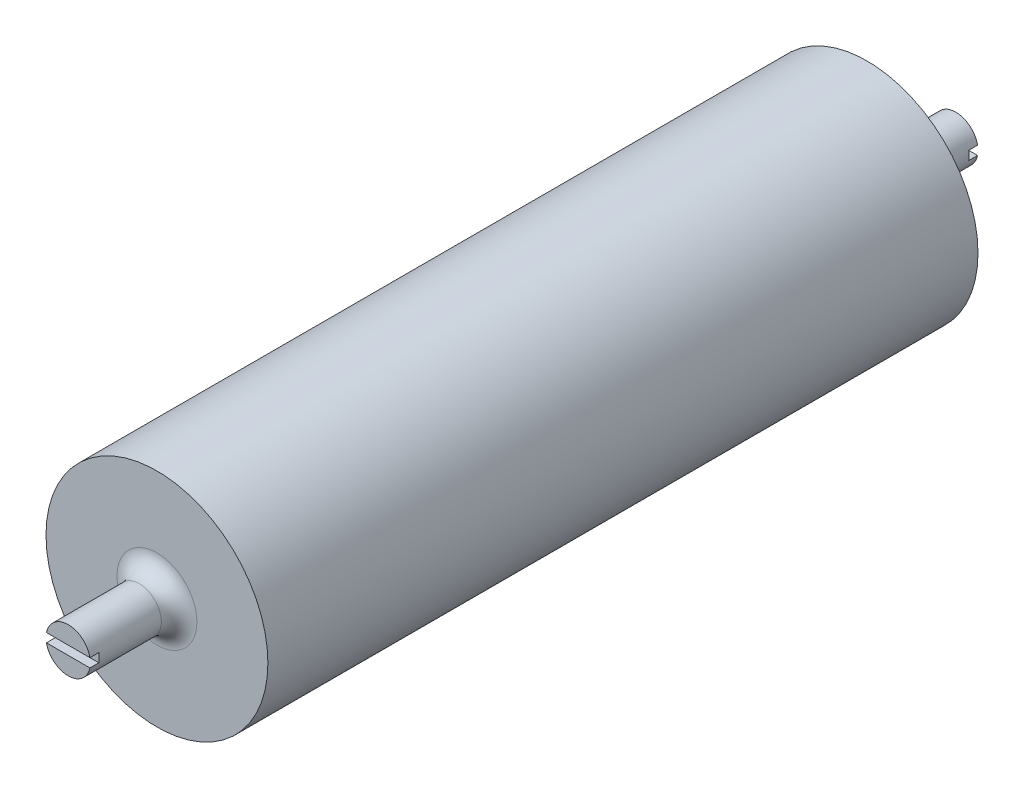
ISO-10303-21;
HEADER;
FILE_DESCRIPTION(('STEP AP214'),'2;1');
FILE_NAME('part.step','',(''),(''),'','','');
FILE_SCHEMA(('AUTOMOTIVE_DESIGN { 1 0 10303 214 1 1 1 1 }'));
ENDSEC;
DATA;
#1=APPLICATION_CONTEXT('core data for automotive mechanical design processes');
#2=APPLICATION_PROTOCOL_DEFINITION('international standard','automotive_design',2000,#1);
#3=PRODUCT_CONTEXT('',#1,'mechanical');
#4=PRODUCT('Part','Part','',(#3));
#5=PRODUCT_RELATED_PRODUCT_CATEGORY('part','',(#4));
#6=PRODUCT_DEFINITION_FORMATION('','',#4);
#7=PRODUCT_DEFINITION_CONTEXT('part definition',#1,'design');
#8=PRODUCT_DEFINITION('design','',#6,#7);
#9=PRODUCT_DEFINITION_SHAPE('','',#8);
#10=(LENGTH_UNIT() NAMED_UNIT(*) SI_UNIT(.MILLI.,.METRE.));
#11=(NAMED_UNIT(*) PLANE_ANGLE_UNIT() SI_UNIT($,.RADIAN.));
#12=(NAMED_UNIT(*) SI_UNIT($,.STERADIAN.) SOLID_ANGLE_UNIT());
#13=UNCERTAINTY_MEASURE_WITH_UNIT(LENGTH_MEASURE(1.E-05),#10,'distance_accuracy_value','');
#14=(GEOMETRIC_REPRESENTATION_CONTEXT(3) GLOBAL_UNCERTAINTY_ASSIGNED_CONTEXT((#13)) GLOBAL_UNIT_ASSIGNED_CONTEXT((#10,
#11,#12)) REPRESENTATION_CONTEXT('',''));
#15=CARTESIAN_POINT('',(0.,0.,0.));
#16=DIRECTION('',(0.,0.,1.));
#17=DIRECTION('',(1.,0.,0.));
#18=AXIS2_PLACEMENT_3D('',#15,#16,#17);
#19=CARTESIAN_POINT('',(0.,0.,90.));
#20=DIRECTION('',(0.,0.,1.));
#21=DIRECTION('',(1.,0.,0.));
#22=AXIS2_PLACEMENT_3D('',#19,#20,#21);
#23=PLANE('',#22);
#24=DIRECTION('',(-1.,0.,0.));
#25=VECTOR('',#24,1.);
#26=CARTESIAN_POINT('',(-2.44948974278318,0.5,90.));
#27=LINE('',#26,#25);
#28=CARTESIAN_POINT('',(2.44948974278318,0.5,90.));
#29=VERTEX_POINT('',#28);
#30=CARTESIAN_POINT('',(-2.44948974278318,0.5,90.));
#31=VERTEX_POINT('',#30);
#32=EDGE_CURVE('E127',#29,#31,#27,.T.);
#33=ORIENTED_EDGE('',*,*,#32,.F.);
#34=CARTESIAN_POINT('',(0.,0.,90.));
#35=DIRECTION('',(0.,0.,1.));
#36=DIRECTION('',(1.,0.,0.));
#37=AXIS2_PLACEMENT_3D('',#34,#35,#36);
#38=CIRCLE('',#37,2.5);
#39=EDGE_CURVE('E189',#29,#31,#38,.T.);
#40=ORIENTED_EDGE('',*,*,#39,.T.);
#41=EDGE_LOOP('',(#33,#40));
#42=FACE_BOUND('',#41,.T.);
#43=ADVANCED_FACE('F44',(#42),#23,.T.);
#44=CARTESIAN_POINT('',(0.,0.,-10.));
#45=DIRECTION('',(0.,0.,1.));
#46=DIRECTION('',(1.,0.,0.));
#47=AXIS2_PLACEMENT_3D('',#44,#45,#46);
#48=PLANE('',#47);
#49=CARTESIAN_POINT('',(0.,0.,-10.));
#50=DIRECTION('',(0.,0.,1.));
#51=DIRECTION('',(1.,0.,0.));
#52=AXIS2_PLACEMENT_3D('',#49,#50,#51);
#53=CIRCLE('',#52,2.5);
#54=CARTESIAN_POINT('',(2.44948974278318,0.5,-10.));
#55=VERTEX_POINT('',#54);
#56=CARTESIAN_POINT('',(-2.44948974278318,0.5,-10.));
#57=VERTEX_POINT('',#56);
#58=EDGE_CURVE('E185',#55,#57,#53,.T.);
#59=ORIENTED_EDGE('',*,*,#58,.F.);
#60=DIRECTION('',(1.,0.,0.));
#61=VECTOR('',#60,1.);
#62=CARTESIAN_POINT('',(2.44948974278318,0.5,-10.));
#63=LINE('',#62,#61);
#64=EDGE_CURVE('E146',#57,#55,#63,.T.);
#65=ORIENTED_EDGE('',*,*,#64,.F.);
#66=EDGE_LOOP('',(#59,#65));
#67=FACE_BOUND('',#66,.T.);
#68=ADVANCED_FACE('F218',(#67),#48,.F.);
#69=CARTESIAN_POINT('',(0.,0.,-2.));
#70=DIRECTION('',(0.,0.,1.));
#71=DIRECTION('',(1.,0.,0.));
#72=AXIS2_PLACEMENT_3D('',#69,#70,#71);
#73=TOROIDAL_SURFACE('',#72,4.5,2.);
#74=CARTESIAN_POINT('',(0.,0.,0.));
#75=DIRECTION('',(0.,0.,1.));
#76=DIRECTION('',(1.,0.,0.));
#77=AXIS2_PLACEMENT_3D('',#74,#75,#76);
#78=CIRCLE('',#77,4.5);
#79=CARTESIAN_POINT('',(4.5,0.,0.));
#80=VERTEX_POINT('',#79);
#81=EDGE_CURVE('E53',#80,#80,#78,.T.);
#82=ORIENTED_EDGE('',*,*,#81,.F.);
#83=EDGE_LOOP('',(#82));
#84=FACE_BOUND('',#83,.T.);
#85=CARTESIAN_POINT('',(0.,0.,-1.99999999999999));
#86=DIRECTION('',(0.,0.,1.));
#87=DIRECTION('',(1.,0.,0.));
#88=AXIS2_PLACEMENT_3D('',#85,#86,#87);
#89=CIRCLE('',#88,2.5);
#90=CARTESIAN_POINT('',(2.5,0.,-1.99999999999999));
#91=VERTEX_POINT('',#90);
#92=EDGE_CURVE('E11',#91,#91,#89,.F.);
#93=ORIENTED_EDGE('',*,*,#92,.F.);
#94=EDGE_LOOP('',(#93));
#95=FACE_BOUND('',#94,.T.);
#96=ADVANCED_FACE('F46',(#84,#95),#73,.F.);
#97=CARTESIAN_POINT('',(0.,0.,82.));
#98=DIRECTION('',(0.,0.,1.));
#99=DIRECTION('',(1.,0.,0.));
#100=AXIS2_PLACEMENT_3D('',#97,#98,#99);
#101=TOROIDAL_SURFACE('',#100,4.5,2.);
#102=CARTESIAN_POINT('',(0.,0.,80.));
#103=DIRECTION('',(0.,0.,1.));
#104=DIRECTION('',(1.,0.,0.));
#105=AXIS2_PLACEMENT_3D('',#102,#103,#104);
#106=CIRCLE('',#105,4.5);
#107=CARTESIAN_POINT('',(4.5,0.,80.));
#108=VERTEX_POINT('',#107);
#109=EDGE_CURVE('E198',#108,#108,#106,.F.);
#110=ORIENTED_EDGE('',*,*,#109,.F.);
#111=EDGE_LOOP('',(#110));
#112=FACE_BOUND('',#111,.T.);
#113=CARTESIAN_POINT('',(0.,0.,82.));
#114=DIRECTION('',(0.,0.,1.));
#115=DIRECTION('',(1.,0.,0.));
#116=AXIS2_PLACEMENT_3D('',#113,#114,#115);
#117=CIRCLE('',#116,2.5);
#118=CARTESIAN_POINT('',(2.5,0.,82.));
#119=VERTEX_POINT('',#118);
#120=EDGE_CURVE('E205',#119,#119,#117,.T.);
#121=ORIENTED_EDGE('',*,*,#120,.F.);
#122=EDGE_LOOP('',(#121));
#123=FACE_BOUND('',#122,.T.);
#124=ADVANCED_FACE('F217',(#112,#123),#101,.F.);
#125=CARTESIAN_POINT('',(0.,0.,80.));
#126=DIRECTION('',(0.,0.,-1.));
#127=DIRECTION('',(-1.,0.,0.));
#128=AXIS2_PLACEMENT_3D('',#125,#126,#127);
#129=CYLINDRICAL_SURFACE('',#128,12.5);
#130=CARTESIAN_POINT('',(0.,0.,80.));
#131=DIRECTION('',(0.,0.,1.));
#132=DIRECTION('',(1.,0.,0.));
#133=AXIS2_PLACEMENT_3D('',#130,#131,#132);
#134=CIRCLE('',#133,12.5);
#135=CARTESIAN_POINT('',(12.5,0.,80.));
#136=VERTEX_POINT('',#135);
#137=EDGE_CURVE('E194',#136,#136,#134,.T.);
#138=ORIENTED_EDGE('',*,*,#137,.F.);
#139=EDGE_LOOP('',(#138));
#140=FACE_BOUND('',#139,.T.);
#141=CARTESIAN_POINT('',(0.,0.,0.));
#142=DIRECTION('',(0.,0.,1.));
#143=DIRECTION('',(1.,0.,0.));
#144=AXIS2_PLACEMENT_3D('',#141,#142,#143);
#145=CIRCLE('',#144,12.5);
#146=CARTESIAN_POINT('',(12.5,0.,0.));
#147=VERTEX_POINT('',#146);
#148=EDGE_CURVE('E193',#147,#147,#145,.T.);
#149=ORIENTED_EDGE('',*,*,#148,.T.);
#150=EDGE_LOOP('',(#149));
#151=FACE_BOUND('',#150,.T.);
#152=ADVANCED_FACE('F384',(#140,#151),#129,.T.);
#153=CARTESIAN_POINT('',(0.,0.,80.));
#154=DIRECTION('',(0.,0.,1.));
#155=DIRECTION('',(1.,0.,0.));
#156=AXIS2_PLACEMENT_3D('',#153,#154,#155);
#157=PLANE('',#156);
#158=ORIENTED_EDGE('',*,*,#109,.T.);
#159=EDGE_LOOP('',(#158));
#160=FACE_BOUND('',#159,.T.);
#161=ORIENTED_EDGE('',*,*,#137,.T.);
#162=EDGE_LOOP('',(#161));
#163=FACE_BOUND('',#162,.T.);
#164=ADVANCED_FACE('F398',(#160,#163),#157,.T.);
#165=CARTESIAN_POINT('',(0.,0.,0.));
#166=DIRECTION('',(0.,0.,1.));
#167=DIRECTION('',(1.,0.,0.));
#168=AXIS2_PLACEMENT_3D('',#165,#166,#167);
#169=PLANE('',#168);
#170=ORIENTED_EDGE('',*,*,#81,.T.);
#171=EDGE_LOOP('',(#170));
#172=FACE_BOUND('',#171,.T.);
#173=ORIENTED_EDGE('',*,*,#148,.F.);
#174=EDGE_LOOP('',(#173));
#175=FACE_BOUND('',#174,.T.);
#176=ADVANCED_FACE('F212',(#172,#175),#169,.F.);
#177=CARTESIAN_POINT('',(-2.44948974278318,-0.5,-10.));
#178=VERTEX_POINT('',#177);
#179=CARTESIAN_POINT('',(2.44948974278318,-0.5,-10.));
#180=VERTEX_POINT('',#179);
#181=EDGE_CURVE('E181',#178,#180,#53,.T.);
#182=ORIENTED_EDGE('',*,*,#181,.F.);
#183=DIRECTION('',(-1.,0.,0.));
#184=VECTOR('',#183,1.);
#185=CARTESIAN_POINT('',(2.44948974278318,-0.5,-10.));
#186=LINE('',#185,#184);
#187=EDGE_CURVE('E157',#180,#178,#186,.T.);
#188=ORIENTED_EDGE('',*,*,#187,.F.);
#189=EDGE_LOOP('',(#182,#188));
#190=FACE_BOUND('',#189,.T.);
#191=ADVANCED_FACE('F223',(#190),#48,.F.);
#192=CARTESIAN_POINT('',(0.,0.,90.));
#193=DIRECTION('',(0.,0.,-1.));
#194=DIRECTION('',(-1.,0.,0.));
#195=AXIS2_PLACEMENT_3D('',#192,#193,#194);
#196=CYLINDRICAL_SURFACE('',#195,2.5);
#197=CARTESIAN_POINT('',(0.,0.,-9.));
#198=DIRECTION('',(0.,0.,-1.));
#199=DIRECTION('',(-1.,0.,0.));
#200=AXIS2_PLACEMENT_3D('',#197,#198,#199);
#201=CIRCLE('',#200,2.5);
#202=CARTESIAN_POINT('',(2.44948974278318,0.5,-9.));
#203=VERTEX_POINT('',#202);
#204=CARTESIAN_POINT('',(2.44948974278318,-0.5,-9.));
#205=VERTEX_POINT('',#204);
#206=EDGE_CURVE('E143',#203,#205,#201,.T.);
#207=ORIENTED_EDGE('',*,*,#206,.F.);
#208=DIRECTION('',(0.,0.,-1.));
#209=VECTOR('',#208,1.);
#210=CARTESIAN_POINT('',(2.44948974278318,0.5,-9.));
#211=LINE('',#210,#209);
#212=EDGE_CURVE('E163',#203,#55,#211,.T.);
#213=ORIENTED_EDGE('',*,*,#212,.T.);
#214=ORIENTED_EDGE('',*,*,#58,.T.);
#215=DIRECTION('',(0.,0.,-1.));
#216=VECTOR('',#215,1.);
#217=CARTESIAN_POINT('',(-2.44948974278318,0.5,-9.));
#218=LINE('',#217,#216);
#219=CARTESIAN_POINT('',(-2.44948974278318,0.5,-9.));
#220=VERTEX_POINT('',#219);
#221=EDGE_CURVE('E168',#220,#57,#218,.T.);
#222=ORIENTED_EDGE('',*,*,#221,.F.);
#223=CARTESIAN_POINT('',(0.,0.,-9.));
#224=DIRECTION('',(0.,0.,-1.));
#225=DIRECTION('',(-1.,0.,0.));
#226=AXIS2_PLACEMENT_3D('',#223,#224,#225);
#227=CIRCLE('',#226,2.5);
#228=CARTESIAN_POINT('',(-2.44948974278318,-0.5,-9.00000000000001));
#229=VERTEX_POINT('',#228);
#230=EDGE_CURVE('E149',#229,#220,#227,.T.);
#231=ORIENTED_EDGE('',*,*,#230,.F.);
#232=DIRECTION('',(0.,0.,-1.));
#233=VECTOR('',#232,1.);
#234=CARTESIAN_POINT('',(-2.44948974278318,-0.5,-9.));
#235=LINE('',#234,#233);
#236=EDGE_CURVE('E171',#229,#178,#235,.T.);
#237=ORIENTED_EDGE('',*,*,#236,.T.);
#238=ORIENTED_EDGE('',*,*,#181,.T.);
#239=DIRECTION('',(0.,0.,-1.));
#240=VECTOR('',#239,1.);
#241=CARTESIAN_POINT('',(2.44948974278318,-0.5,-9.));
#242=LINE('',#241,#240);
#243=EDGE_CURVE('E156',#205,#180,#242,.T.);
#244=ORIENTED_EDGE('',*,*,#243,.F.);
#245=EDGE_LOOP('',(#207,#213,#214,#222,#231,#237,#238,#244));
#246=FACE_BOUND('',#245,.T.);
#247=ORIENTED_EDGE('',*,*,#92,.T.);
#248=EDGE_LOOP('',(#247));
#249=FACE_BOUND('',#248,.T.);
#250=ADVANCED_FACE('F221',(#246,#249),#196,.T.);
#251=CARTESIAN_POINT('',(0.,0.,89.));
#252=DIRECTION('',(0.,0.,1.));
#253=DIRECTION('',(1.,0.,0.));
#254=AXIS2_PLACEMENT_3D('',#251,#252,#253);
#255=CIRCLE('',#254,2.5);
#256=CARTESIAN_POINT('',(-2.44948974278318,0.5,89.));
#257=VERTEX_POINT('',#256);
#258=CARTESIAN_POINT('',(-2.44948974278318,-0.5,89.));
#259=VERTEX_POINT('',#258);
#260=EDGE_CURVE('E117',#257,#259,#255,.T.);
#261=ORIENTED_EDGE('',*,*,#260,.F.);
#262=DIRECTION('',(0.,0.,1.));
#263=VECTOR('',#262,1.);
#264=CARTESIAN_POINT('',(-2.44948974278318,0.5,89.));
#265=LINE('',#264,#263);
#266=EDGE_CURVE('E160',#257,#31,#265,.T.);
#267=ORIENTED_EDGE('',*,*,#266,.T.);
#268=ORIENTED_EDGE('',*,*,#39,.F.);
#269=DIRECTION('',(0.,0.,1.));
#270=VECTOR('',#269,1.);
#271=CARTESIAN_POINT('',(2.44948974278318,0.5,89.));
#272=LINE('',#271,#270);
#273=CARTESIAN_POINT('',(2.44948974278318,0.5,89.));
#274=VERTEX_POINT('',#273);
#275=EDGE_CURVE('E138',#274,#29,#272,.T.);
#276=ORIENTED_EDGE('',*,*,#275,.F.);
#277=CARTESIAN_POINT('',(0.,0.,89.));
#278=DIRECTION('',(0.,0.,1.));
#279=DIRECTION('',(1.,0.,0.));
#280=AXIS2_PLACEMENT_3D('',#277,#278,#279);
#281=CIRCLE('',#280,2.5);
#282=CARTESIAN_POINT('',(2.44948974278318,-0.5,89.));
#283=VERTEX_POINT('',#282);
#284=EDGE_CURVE('E116',#283,#274,#281,.T.);
#285=ORIENTED_EDGE('',*,*,#284,.F.);
#286=DIRECTION('',(0.,0.,1.));
#287=VECTOR('',#286,1.);
#288=CARTESIAN_POINT('',(2.44948974278318,-0.5,89.));
#289=LINE('',#288,#287);
#290=CARTESIAN_POINT('',(2.44948974278318,-0.5,90.));
#291=VERTEX_POINT('',#290);
#292=EDGE_CURVE('E112',#283,#291,#289,.T.);
#293=ORIENTED_EDGE('',*,*,#292,.T.);
#294=CARTESIAN_POINT('',(-2.44948974278318,-0.5,90.));
#295=VERTEX_POINT('',#294);
#296=EDGE_CURVE('E133',#295,#291,#38,.T.);
#297=ORIENTED_EDGE('',*,*,#296,.F.);
#298=DIRECTION('',(0.,0.,1.));
#299=VECTOR('',#298,1.);
#300=CARTESIAN_POINT('',(-2.44948974278318,-0.5,89.));
#301=LINE('',#300,#299);
#302=EDGE_CURVE('E60',#259,#295,#301,.T.);
#303=ORIENTED_EDGE('',*,*,#302,.F.);
#304=EDGE_LOOP('',(#261,#267,#268,#276,#285,#293,#297,#303));
#305=FACE_BOUND('',#304,.T.);
#306=ORIENTED_EDGE('',*,*,#120,.T.);
#307=EDGE_LOOP('',(#306));
#308=FACE_BOUND('',#307,.T.);
#309=ADVANCED_FACE('F130',(#305,#308),#196,.T.);
#310=DIRECTION('',(1.,0.,0.));
#311=VECTOR('',#310,1.);
#312=CARTESIAN_POINT('',(-2.44948974278318,-0.5,90.));
#313=LINE('',#312,#311);
#314=EDGE_CURVE('E252',#295,#291,#313,.T.);
#315=ORIENTED_EDGE('',*,*,#314,.F.);
#316=ORIENTED_EDGE('',*,*,#296,.T.);
#317=EDGE_LOOP('',(#315,#316));
#318=FACE_BOUND('',#317,.T.);
#319=ADVANCED_FACE('F230',(#318),#23,.T.);
#320=CARTESIAN_POINT('',(2.44948974278318,0.5,-9.));
#321=DIRECTION('',(0.,1.,0.));
#322=DIRECTION('',(0.,0.,1.));
#323=AXIS2_PLACEMENT_3D('',#320,#321,#322);
#324=PLANE('',#323);
#325=ORIENTED_EDGE('',*,*,#64,.T.);
#326=ORIENTED_EDGE('',*,*,#212,.F.);
#327=DIRECTION('',(1.,0.,0.));
#328=VECTOR('',#327,1.);
#329=CARTESIAN_POINT('',(2.44948974278318,0.5,-9.));
#330=LINE('',#329,#328);
#331=EDGE_CURVE('E152',#220,#203,#330,.T.);
#332=ORIENTED_EDGE('',*,*,#331,.F.);
#333=ORIENTED_EDGE('',*,*,#221,.T.);
#334=EDGE_LOOP('',(#325,#326,#332,#333));
#335=FACE_BOUND('',#334,.T.);
#336=ADVANCED_FACE('F244',(#335),#324,.F.);
#337=CARTESIAN_POINT('',(2.44948974278318,-0.5,-9.));
#338=DIRECTION('',(0.,-1.,0.));
#339=DIRECTION('',(0.,0.,-1.));
#340=AXIS2_PLACEMENT_3D('',#337,#338,#339);
#341=PLANE('',#340);
#342=ORIENTED_EDGE('',*,*,#187,.T.);
#343=ORIENTED_EDGE('',*,*,#236,.F.);
#344=DIRECTION('',(-1.,0.,0.));
#345=VECTOR('',#344,1.);
#346=CARTESIAN_POINT('',(2.44948974278318,-0.5,-9.));
#347=LINE('',#346,#345);
#348=EDGE_CURVE('E68',#205,#229,#347,.T.);
#349=ORIENTED_EDGE('',*,*,#348,.F.);
#350=ORIENTED_EDGE('',*,*,#243,.T.);
#351=EDGE_LOOP('',(#342,#343,#349,#350));
#352=FACE_BOUND('',#351,.T.);
#353=ADVANCED_FACE('F249',(#352),#341,.F.);
#354=CARTESIAN_POINT('',(0.,0.,-9.));
#355=DIRECTION('',(0.,0.,-1.));
#356=DIRECTION('',(-1.,0.,0.));
#357=AXIS2_PLACEMENT_3D('',#354,#355,#356);
#358=PLANE('',#357);
#359=ORIENTED_EDGE('',*,*,#206,.T.);
#360=ORIENTED_EDGE('',*,*,#348,.T.);
#361=ORIENTED_EDGE('',*,*,#230,.T.);
#362=ORIENTED_EDGE('',*,*,#331,.T.);
#363=EDGE_LOOP('',(#359,#360,#361,#362));
#364=FACE_BOUND('',#363,.T.);
#365=ADVANCED_FACE('F267',(#364),#358,.T.);
#366=CARTESIAN_POINT('',(-2.44948974278318,0.5,89.));
#367=DIRECTION('',(0.,1.,0.));
#368=DIRECTION('',(0.,0.,1.));
#369=AXIS2_PLACEMENT_3D('',#366,#367,#368);
#370=PLANE('',#369);
#371=ORIENTED_EDGE('',*,*,#32,.T.);
#372=ORIENTED_EDGE('',*,*,#266,.F.);
#373=DIRECTION('',(-1.,0.,0.));
#374=VECTOR('',#373,1.);
#375=CARTESIAN_POINT('',(-2.44948974278318,0.5,89.));
#376=LINE('',#375,#374);
#377=EDGE_CURVE('E123',#274,#257,#376,.T.);
#378=ORIENTED_EDGE('',*,*,#377,.F.);
#379=ORIENTED_EDGE('',*,*,#275,.T.);
#380=EDGE_LOOP('',(#371,#372,#378,#379));
#381=FACE_BOUND('',#380,.T.);
#382=ADVANCED_FACE('F263',(#381),#370,.F.);
#383=CARTESIAN_POINT('',(-2.44948974278318,-0.5,89.));
#384=DIRECTION('',(0.,-1.,0.));
#385=DIRECTION('',(0.,0.,-1.));
#386=AXIS2_PLACEMENT_3D('',#383,#384,#385);
#387=PLANE('',#386);
#388=ORIENTED_EDGE('',*,*,#314,.T.);
#389=ORIENTED_EDGE('',*,*,#292,.F.);
#390=DIRECTION('',(1.,0.,0.));
#391=VECTOR('',#390,1.);
#392=CARTESIAN_POINT('',(-2.44948974278318,-0.5,89.));
#393=LINE('',#392,#391);
#394=EDGE_CURVE('E108',#259,#283,#393,.T.);
#395=ORIENTED_EDGE('',*,*,#394,.F.);
#396=ORIENTED_EDGE('',*,*,#302,.T.);
#397=EDGE_LOOP('',(#388,#389,#395,#396));
#398=FACE_BOUND('',#397,.T.);
#399=ADVANCED_FACE('F110',(#398),#387,.F.);
#400=CARTESIAN_POINT('',(0.,0.,89.));
#401=DIRECTION('',(0.,0.,1.));
#402=DIRECTION('',(1.,0.,0.));
#403=AXIS2_PLACEMENT_3D('',#400,#401,#402);
#404=PLANE('',#403);
#405=ORIENTED_EDGE('',*,*,#260,.T.);
#406=ORIENTED_EDGE('',*,*,#394,.T.);
#407=ORIENTED_EDGE('',*,*,#284,.T.);
#408=ORIENTED_EDGE('',*,*,#377,.T.);
#409=EDGE_LOOP('',(#405,#406,#407,#408));
#410=FACE_BOUND('',#409,.T.);
#411=ADVANCED_FACE('F121',(#410),#404,.T.);
#412=CLOSED_SHELL('',(#43,#68,#96,#124,#152,#164,#176,#191,#250,#309,#319,#336,#353,#365,#382,
#399,#411));
#413=CARTESIAN_POINT('',(0.,0.,-5.));
#414=DIRECTION('',(0.,0.,1.));
#415=DIRECTION('',(1.,0.,0.));
#416=AXIS2_PLACEMENT_3D('',#413,#414,#415);
#417=CYLINDRICAL_SURFACE('',#416,0.5);
#418=CARTESIAN_POINT('',(0.,0.,-5.));
#419=DIRECTION('',(0.,0.,1.));
#420=DIRECTION('',(1.,0.,0.));
#421=AXIS2_PLACEMENT_3D('',#418,#419,#420);
#422=CIRCLE('',#421,0.5);
#423=CARTESIAN_POINT('',(0.5,0.,-5.));
#424=VERTEX_POINT('',#423);
#425=EDGE_CURVE('E177',#424,#424,#422,.T.);
#426=ORIENTED_EDGE('',*,*,#425,.F.);
#427=EDGE_LOOP('',(#426));
#428=FACE_BOUND('',#427,.T.);
#429=CARTESIAN_POINT('',(0.,0.,85.));
#430=DIRECTION('',(0.,0.,1.));
#431=DIRECTION('',(1.,0.,0.));
#432=AXIS2_PLACEMENT_3D('',#429,#430,#431);
#433=CIRCLE('',#432,0.5);
#434=CARTESIAN_POINT('',(0.5,0.,85.));
#435=VERTEX_POINT('',#434);
#436=EDGE_CURVE('E167',#435,#435,#433,.T.);
#437=ORIENTED_EDGE('',*,*,#436,.T.);
#438=EDGE_LOOP('',(#437));
#439=FACE_BOUND('',#438,.T.);
#440=ADVANCED_FACE('F284',(#428,#439),#417,.F.);
#441=CARTESIAN_POINT('',(0.,0.,-5.));
#442=DIRECTION('',(0.,0.,1.));
#443=DIRECTION('',(1.,0.,0.));
#444=AXIS2_PLACEMENT_3D('',#441,#442,#443);
#445=PLANE('',#444);
#446=ORIENTED_EDGE('',*,*,#425,.T.);
#447=EDGE_LOOP('',(#446));
#448=FACE_BOUND('',#447,.T.);
#449=ADVANCED_FACE('F280',(#448),#445,.T.);
#450=CARTESIAN_POINT('',(0.,0.,85.));
#451=DIRECTION('',(0.,0.,1.));
#452=DIRECTION('',(1.,0.,0.));
#453=AXIS2_PLACEMENT_3D('',#450,#451,#452);
#454=PLANE('',#453);
#455=ORIENTED_EDGE('',*,*,#436,.F.);
#456=EDGE_LOOP('',(#455));
#457=FACE_BOUND('',#456,.T.);
#458=ADVANCED_FACE('F283',(#457),#454,.F.);
#459=CLOSED_SHELL('',(#440,#449,#458));
#460=ORIENTED_CLOSED_SHELL('',*,#459,.T.);
#461=BREP_WITH_VOIDS('B2',#412,(#460));
#462=ADVANCED_BREP_SHAPE_REPRESENTATION('',(#18,#461),#14);
#463=SHAPE_DEFINITION_REPRESENTATION(#9,#462);
ENDSEC;
END-ISO-10303-21;
